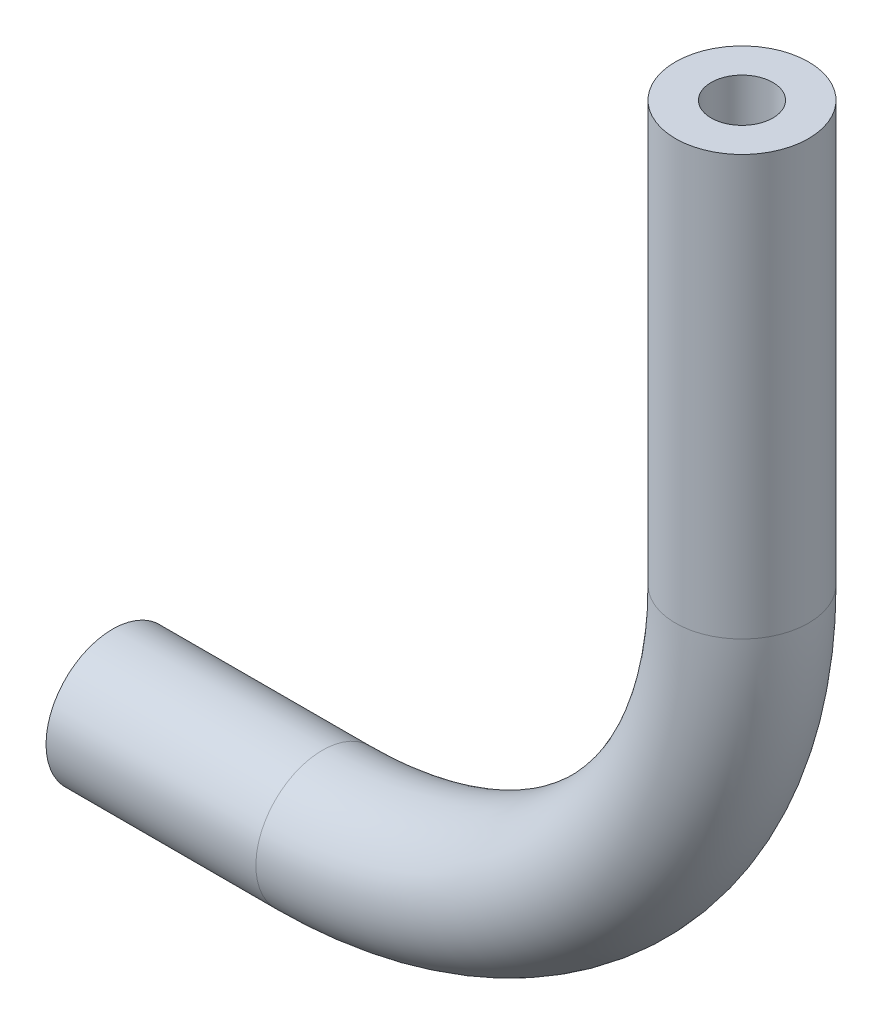
ISO-10303-21;
HEADER;
FILE_DESCRIPTION(('STEP AP214'),'2;1');
FILE_NAME('part.step','',(''),(''),'','','');
FILE_SCHEMA(('AUTOMOTIVE_DESIGN { 1 0 10303 214 1 1 1 1 }'));
ENDSEC;
DATA;
#1=APPLICATION_CONTEXT('core data for automotive mechanical design processes');
#2=APPLICATION_PROTOCOL_DEFINITION('international standard','automotive_design',2000,#1);
#3=PRODUCT_CONTEXT('',#1,'mechanical');
#4=PRODUCT('Part','Part','',(#3));
#5=PRODUCT_RELATED_PRODUCT_CATEGORY('part','',(#4));
#6=PRODUCT_DEFINITION_FORMATION('','',#4);
#7=PRODUCT_DEFINITION_CONTEXT('part definition',#1,'design');
#8=PRODUCT_DEFINITION('design','',#6,#7);
#9=PRODUCT_DEFINITION_SHAPE('','',#8);
#10=(LENGTH_UNIT() NAMED_UNIT(*) SI_UNIT(.MILLI.,.METRE.));
#11=(NAMED_UNIT(*) PLANE_ANGLE_UNIT() SI_UNIT($,.RADIAN.));
#12=(NAMED_UNIT(*) SI_UNIT($,.STERADIAN.) SOLID_ANGLE_UNIT());
#13=UNCERTAINTY_MEASURE_WITH_UNIT(LENGTH_MEASURE(1.E-05),#10,'distance_accuracy_value','');
#14=(GEOMETRIC_REPRESENTATION_CONTEXT(3) GLOBAL_UNCERTAINTY_ASSIGNED_CONTEXT((#13)) GLOBAL_UNIT_ASSIGNED_CONTEXT((#10,
#11,#12)) REPRESENTATION_CONTEXT('',''));
#15=CARTESIAN_POINT('',(0.,0.,0.));
#16=DIRECTION('',(0.,0.,1.));
#17=DIRECTION('',(1.,0.,0.));
#18=AXIS2_PLACEMENT_3D('',#15,#16,#17);
#19=CARTESIAN_POINT('',(0.,20.,0.));
#20=DIRECTION('',(0.,1.,0.));
#21=DIRECTION('',(-1.,0.,0.));
#22=AXIS2_PLACEMENT_3D('',#19,#20,#21);
#23=PLANE('',#22);
#24=CARTESIAN_POINT('',(0.,20.,0.));
#25=DIRECTION('',(0.,1.,0.));
#26=DIRECTION('',(-1.,0.,0.));
#27=AXIS2_PLACEMENT_3D('',#24,#25,#26);
#28=CIRCLE('',#27,0.735);
#29=CARTESIAN_POINT('',(-0.735,20.,0.));
#30=VERTEX_POINT('',#29);
#31=EDGE_CURVE('E56',#30,#30,#28,.T.);
#32=ORIENTED_EDGE('',*,*,#31,.F.);
#33=EDGE_LOOP('',(#32));
#34=FACE_BOUND('',#33,.T.);
#35=CARTESIAN_POINT('',(0.,20.,0.));
#36=DIRECTION('',(0.,1.,0.));
#37=DIRECTION('',(-1.,0.,0.));
#38=AXIS2_PLACEMENT_3D('',#35,#36,#37);
#39=CIRCLE('',#38,1.585);
#40=CARTESIAN_POINT('',(-1.585,20.,0.));
#41=VERTEX_POINT('',#40);
#42=EDGE_CURVE('E47',#41,#41,#39,.T.);
#43=ORIENTED_EDGE('',*,*,#42,.T.);
#44=EDGE_LOOP('',(#43));
#45=FACE_BOUND('',#44,.T.);
#46=ADVANCED_FACE('F33',(#34,#45),#23,.T.);
#47=CARTESIAN_POINT('',(-15.,0.,0.));
#48=DIRECTION('',(1.,0.,0.));
#49=DIRECTION('',(0.,1.,0.));
#50=AXIS2_PLACEMENT_3D('',#47,#48,#49);
#51=PLANE('',#50);
#52=CARTESIAN_POINT('',(-15.,0.,0.));
#53=DIRECTION('',(1.,0.,0.));
#54=DIRECTION('',(0.,1.,0.));
#55=AXIS2_PLACEMENT_3D('',#52,#53,#54);
#56=CIRCLE('',#55,0.735);
#57=CARTESIAN_POINT('',(-15.,0.735,0.));
#58=VERTEX_POINT('',#57);
#59=EDGE_CURVE('E52',#58,#58,#56,.T.);
#60=ORIENTED_EDGE('',*,*,#59,.T.);
#61=EDGE_LOOP('',(#60));
#62=FACE_BOUND('',#61,.T.);
#63=CARTESIAN_POINT('',(-15.,0.,0.));
#64=DIRECTION('',(1.,0.,0.));
#65=DIRECTION('',(0.,1.,0.));
#66=AXIS2_PLACEMENT_3D('',#63,#64,#65);
#67=CIRCLE('',#66,1.585);
#68=CARTESIAN_POINT('',(-15.,1.585,0.));
#69=VERTEX_POINT('',#68);
#70=EDGE_CURVE('E10',#69,#69,#67,.T.);
#71=ORIENTED_EDGE('',*,*,#70,.F.);
#72=EDGE_LOOP('',(#71));
#73=FACE_BOUND('',#72,.T.);
#74=ADVANCED_FACE('F76',(#62,#73),#51,.F.);
#75=CARTESIAN_POINT('',(0.,20.,0.));
#76=DIRECTION('',(0.,-1.,0.));
#77=DIRECTION('',(0.,0.,-1.));
#78=AXIS2_PLACEMENT_3D('',#75,#76,#77);
#79=CYLINDRICAL_SURFACE('',#78,1.585);
#80=CARTESIAN_POINT('',(0.,10.,0.));
#81=DIRECTION('',(0.,1.,0.));
#82=DIRECTION('',(-1.,0.,0.));
#83=AXIS2_PLACEMENT_3D('',#80,#81,#82);
#84=CIRCLE('',#83,1.585);
#85=CARTESIAN_POINT('',(1.585,10.,0.));
#86=VERTEX_POINT('',#85);
#87=EDGE_CURVE('E43',#86,#86,#84,.T.);
#88=ORIENTED_EDGE('',*,*,#87,.T.);
#89=EDGE_LOOP('',(#88));
#90=FACE_BOUND('',#89,.T.);
#91=ORIENTED_EDGE('',*,*,#42,.F.);
#92=EDGE_LOOP('',(#91));
#93=FACE_BOUND('',#92,.T.);
#94=ADVANCED_FACE('F80',(#90,#93),#79,.T.);
#95=CARTESIAN_POINT('',(-10.,10.,0.));
#96=DIRECTION('',(0.,0.,-1.));
#97=DIRECTION('',(-1.,0.,0.));
#98=AXIS2_PLACEMENT_3D('',#95,#96,#97);
#99=TOROIDAL_SURFACE('',#98,10.,1.585);
#100=CARTESIAN_POINT('',(-10.,0.,0.));
#101=DIRECTION('',(1.,0.,0.));
#102=DIRECTION('',(0.,1.,0.));
#103=AXIS2_PLACEMENT_3D('',#100,#101,#102);
#104=CIRCLE('',#103,1.585);
#105=CARTESIAN_POINT('',(-10.,-1.585,0.));
#106=VERTEX_POINT('',#105);
#107=EDGE_CURVE('E39',#106,#106,#104,.T.);
#108=CARTESIAN_POINT('',(-10.,10.,0.));
#109=DIRECTION('',(0.,0.,-1.));
#110=DIRECTION('',(-1.,0.,0.));
#111=AXIS2_PLACEMENT_3D('',#108,#109,#110);
#112=CIRCLE('',#111,11.585);
#113=EDGE_CURVE('',#86,#106,#112,.T.);
#114=ORIENTED_EDGE('',*,*,#87,.F.);
#115=ORIENTED_EDGE('',*,*,#107,.T.);
#116=ORIENTED_EDGE('',*,*,#113,.T.);
#117=ORIENTED_EDGE('',*,*,#113,.F.);
#118=EDGE_LOOP('',(#114,#116,#115,#117));
#119=FACE_BOUND('',#118,.T.);
#120=ADVANCED_FACE('F82',(#119),#99,.T.);
#121=CARTESIAN_POINT('',(-10.,0.,0.));
#122=DIRECTION('',(-1.,0.,0.));
#123=DIRECTION('',(0.,-1.,0.));
#124=AXIS2_PLACEMENT_3D('',#121,#122,#123);
#125=CYLINDRICAL_SURFACE('',#124,1.585);
#126=ORIENTED_EDGE('',*,*,#70,.T.);
#127=EDGE_LOOP('',(#126));
#128=FACE_BOUND('',#127,.T.);
#129=ORIENTED_EDGE('',*,*,#107,.F.);
#130=EDGE_LOOP('',(#129));
#131=FACE_BOUND('',#130,.T.);
#132=ADVANCED_FACE('F70',(#128,#131),#125,.T.);
#133=CARTESIAN_POINT('',(0.,20.,0.));
#134=DIRECTION('',(0.,-1.,0.));
#135=DIRECTION('',(0.,0.,-1.));
#136=AXIS2_PLACEMENT_3D('',#133,#134,#135);
#137=CYLINDRICAL_SURFACE('',#136,0.735);
#138=CARTESIAN_POINT('',(0.,10.,0.));
#139=DIRECTION('',(0.,-1.,0.));
#140=DIRECTION('',(0.,0.,-1.));
#141=AXIS2_PLACEMENT_3D('',#138,#139,#140);
#142=CIRCLE('',#141,0.735);
#143=CARTESIAN_POINT('',(0.735,10.,0.));
#144=VERTEX_POINT('',#143);
#145=EDGE_CURVE('E59',#144,#144,#142,.F.);
#146=ORIENTED_EDGE('',*,*,#145,.F.);
#147=EDGE_LOOP('',(#146));
#148=FACE_BOUND('',#147,.T.);
#149=ORIENTED_EDGE('',*,*,#31,.T.);
#150=EDGE_LOOP('',(#149));
#151=FACE_BOUND('',#150,.T.);
#152=ADVANCED_FACE('F67',(#148,#151),#137,.F.);
#153=CARTESIAN_POINT('',(-10.,10.,0.));
#154=DIRECTION('',(0.,0.,-1.));
#155=DIRECTION('',(-1.,0.,0.));
#156=AXIS2_PLACEMENT_3D('',#153,#154,#155);
#157=TOROIDAL_SURFACE('',#156,10.,0.735);
#158=CARTESIAN_POINT('',(-10.,0.,0.));
#159=DIRECTION('',(1.,0.,0.));
#160=DIRECTION('',(0.,1.,0.));
#161=AXIS2_PLACEMENT_3D('',#158,#159,#160);
#162=CIRCLE('',#161,0.735);
#163=CARTESIAN_POINT('',(-10.,-0.735,0.));
#164=VERTEX_POINT('',#163);
#165=EDGE_CURVE('E55',#164,#164,#162,.T.);
#166=CARTESIAN_POINT('',(-10.,10.,0.));
#167=DIRECTION('',(0.,0.,-1.));
#168=DIRECTION('',(-1.,0.,0.));
#169=AXIS2_PLACEMENT_3D('',#166,#167,#168);
#170=CIRCLE('',#169,10.735);
#171=EDGE_CURVE('',#144,#164,#170,.T.);
#172=ORIENTED_EDGE('',*,*,#145,.T.);
#173=ORIENTED_EDGE('',*,*,#165,.F.);
#174=ORIENTED_EDGE('',*,*,#171,.T.);
#175=ORIENTED_EDGE('',*,*,#171,.F.);
#176=EDGE_LOOP('',(#172,#174,#173,#175));
#177=FACE_BOUND('',#176,.T.);
#178=ADVANCED_FACE('F65',(#177),#157,.F.);
#179=CARTESIAN_POINT('',(-10.,0.,0.));
#180=DIRECTION('',(-1.,0.,0.));
#181=DIRECTION('',(0.,-1.,0.));
#182=AXIS2_PLACEMENT_3D('',#179,#180,#181);
#183=CYLINDRICAL_SURFACE('',#182,0.735);
#184=ORIENTED_EDGE('',*,*,#59,.F.);
#185=EDGE_LOOP('',(#184));
#186=FACE_BOUND('',#185,.T.);
#187=ORIENTED_EDGE('',*,*,#165,.T.);
#188=EDGE_LOOP('',(#187));
#189=FACE_BOUND('',#188,.T.);
#190=ADVANCED_FACE('F77',(#186,#189),#183,.F.);
#191=CLOSED_SHELL('',(#46,#74,#94,#120,#132,#152,#178,#190));
#192=MANIFOLD_SOLID_BREP('B2',#191);
#193=ADVANCED_BREP_SHAPE_REPRESENTATION('',(#18,#192),#14);
#194=SHAPE_DEFINITION_REPRESENTATION(#9,#193);
ENDSEC;
END-ISO-10303-21;
